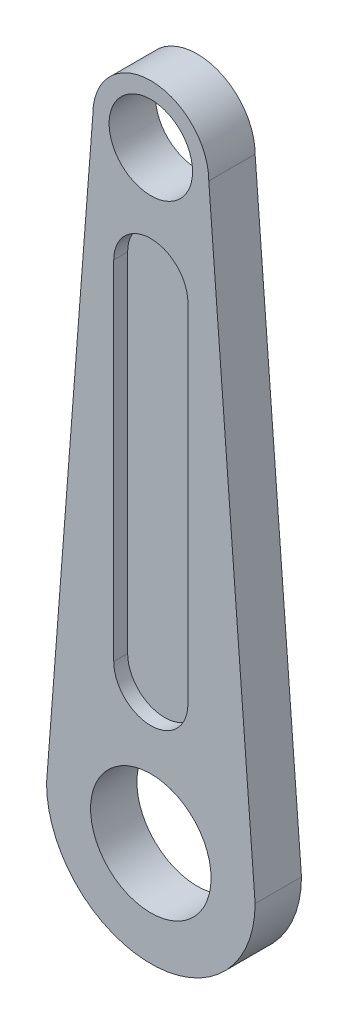
ISO-10303-21;
HEADER;
FILE_DESCRIPTION(('STEP AP214'),'2;1');
FILE_NAME('part.step','',(''),(''),'','','');
FILE_SCHEMA(('AUTOMOTIVE_DESIGN { 1 0 10303 214 1 1 1 1 }'));
ENDSEC;
DATA;
#1=APPLICATION_CONTEXT('core data for automotive mechanical design processes');
#2=APPLICATION_PROTOCOL_DEFINITION('international standard','automotive_design',2000,#1);
#3=PRODUCT_CONTEXT('',#1,'mechanical');
#4=PRODUCT('Part','Part','',(#3));
#5=PRODUCT_RELATED_PRODUCT_CATEGORY('part','',(#4));
#6=PRODUCT_DEFINITION_FORMATION('','',#4);
#7=PRODUCT_DEFINITION_CONTEXT('part definition',#1,'design');
#8=PRODUCT_DEFINITION('design','',#6,#7);
#9=PRODUCT_DEFINITION_SHAPE('','',#8);
#10=(LENGTH_UNIT() NAMED_UNIT(*) SI_UNIT(.MILLI.,.METRE.));
#11=(NAMED_UNIT(*) PLANE_ANGLE_UNIT() SI_UNIT($,.RADIAN.));
#12=(NAMED_UNIT(*) SI_UNIT($,.STERADIAN.) SOLID_ANGLE_UNIT());
#13=UNCERTAINTY_MEASURE_WITH_UNIT(LENGTH_MEASURE(1.E-05),#10,'distance_accuracy_value','');
#14=(GEOMETRIC_REPRESENTATION_CONTEXT(3) GLOBAL_UNCERTAINTY_ASSIGNED_CONTEXT((#13)) GLOBAL_UNIT_ASSIGNED_CONTEXT((#10,
#11,#12)) REPRESENTATION_CONTEXT('',''));
#15=CARTESIAN_POINT('',(0.,0.,0.));
#16=DIRECTION('',(0.,0.,1.));
#17=DIRECTION('',(1.,0.,0.));
#18=AXIS2_PLACEMENT_3D('',#15,#16,#17);
#19=CARTESIAN_POINT('',(0.,0.,-5.));
#20=DIRECTION('',(0.,0.,1.));
#21=DIRECTION('',(1.,0.,0.));
#22=AXIS2_PLACEMENT_3D('',#19,#20,#21);
#23=PLANE('',#22);
#24=DIRECTION('',(-0.076696498884737,-0.997054485501582,0.));
#25=VECTOR('',#24,1.);
#26=CARTESIAN_POINT('',(-22.3676470588235,1.72058823529412,-5.));
#27=LINE('',#26,#25);
#28=CARTESIAN_POINT('',(-12.5,130.,-5.));
#29=VERTEX_POINT('',#28);
#30=CARTESIAN_POINT('',(-22.5,0.,-5.));
#31=VERTEX_POINT('',#30);
#32=EDGE_CURVE('E218',#29,#31,#27,.T.);
#33=ORIENTED_EDGE('',*,*,#32,.F.);
#34=CARTESIAN_POINT('',(0.,130.,-5.));
#35=DIRECTION('',(0.,0.,1.));
#36=DIRECTION('',(1.,0.,0.));
#37=AXIS2_PLACEMENT_3D('',#34,#35,#36);
#38=CIRCLE('',#37,12.5);
#39=CARTESIAN_POINT('',(12.5,130.,-5.));
#40=VERTEX_POINT('',#39);
#41=EDGE_CURVE('E199',#40,#29,#38,.T.);
#42=ORIENTED_EDGE('',*,*,#41,.F.);
#43=DIRECTION('',(0.076696498884737,-0.997054485501582,0.));
#44=VECTOR('',#43,1.);
#45=CARTESIAN_POINT('',(22.3676470588235,1.72058823529412,-5.));
#46=LINE('',#45,#44);
#47=CARTESIAN_POINT('',(22.5,0.,-5.));
#48=VERTEX_POINT('',#47);
#49=EDGE_CURVE('E224',#40,#48,#46,.T.);
#50=ORIENTED_EDGE('',*,*,#49,.T.);
#51=CARTESIAN_POINT('',(0.,0.,-5.));
#52=DIRECTION('',(0.,0.,1.));
#53=DIRECTION('',(1.,0.,0.));
#54=AXIS2_PLACEMENT_3D('',#51,#52,#53);
#55=CIRCLE('',#54,22.5);
#56=EDGE_CURVE('E221',#31,#48,#55,.T.);
#57=ORIENTED_EDGE('',*,*,#56,.F.);
#58=EDGE_LOOP('',(#33,#42,#50,#57));
#59=FACE_BOUND('',#58,.T.);
#60=CARTESIAN_POINT('',(0.,0.,-5.));
#61=DIRECTION('',(0.,0.,1.));
#62=DIRECTION('',(1.,0.,0.));
#63=AXIS2_PLACEMENT_3D('',#60,#61,#62);
#64=CIRCLE('',#63,13.);
#65=CARTESIAN_POINT('',(13.,0.,-5.));
#66=VERTEX_POINT('',#65);
#67=EDGE_CURVE('E215',#66,#66,#64,.T.);
#68=ORIENTED_EDGE('',*,*,#67,.T.);
#69=EDGE_LOOP('',(#68));
#70=FACE_BOUND('',#69,.T.);
#71=CARTESIAN_POINT('',(0.,130.,-5.));
#72=DIRECTION('',(0.,0.,1.));
#73=DIRECTION('',(1.,0.,0.));
#74=AXIS2_PLACEMENT_3D('',#71,#72,#73);
#75=CIRCLE('',#74,9.);
#76=CARTESIAN_POINT('',(9.,130.,-5.));
#77=VERTEX_POINT('',#76);
#78=EDGE_CURVE('E189',#77,#77,#75,.T.);
#79=ORIENTED_EDGE('',*,*,#78,.T.);
#80=EDGE_LOOP('',(#79));
#81=FACE_BOUND('',#80,.T.);
#82=CARTESIAN_POINT('',(0.,105.,-5.));
#83=DIRECTION('',(0.,0.,1.));
#84=DIRECTION('',(1.,0.,0.));
#85=AXIS2_PLACEMENT_3D('',#82,#83,#84);
#86=CIRCLE('',#85,8.);
#87=CARTESIAN_POINT('',(8.,105.,-5.));
#88=VERTEX_POINT('',#87);
#89=CARTESIAN_POINT('',(-8.,105.,-5.));
#90=VERTEX_POINT('',#89);
#91=EDGE_CURVE('E52',#88,#90,#86,.T.);
#92=ORIENTED_EDGE('',*,*,#91,.T.);
#93=DIRECTION('',(0.,-1.,0.));
#94=VECTOR('',#93,1.);
#95=CARTESIAN_POINT('',(-8.,105.,-5.));
#96=LINE('',#95,#94);
#97=CARTESIAN_POINT('',(-7.99999999999999,30.,-5.));
#98=VERTEX_POINT('',#97);
#99=EDGE_CURVE('E146',#90,#98,#96,.T.);
#100=ORIENTED_EDGE('',*,*,#99,.T.);
#101=CARTESIAN_POINT('',(0.,30.,-5.));
#102=DIRECTION('',(0.,0.,1.));
#103=DIRECTION('',(1.,0.,0.));
#104=AXIS2_PLACEMENT_3D('',#101,#102,#103);
#105=CIRCLE('',#104,8.);
#106=CARTESIAN_POINT('',(8.00000000000001,30.,-5.));
#107=VERTEX_POINT('',#106);
#108=EDGE_CURVE('E149',#98,#107,#105,.T.);
#109=ORIENTED_EDGE('',*,*,#108,.T.);
#110=DIRECTION('',(0.,1.,0.));
#111=VECTOR('',#110,1.);
#112=CARTESIAN_POINT('',(8.,105.,-5.));
#113=LINE('',#112,#111);
#114=EDGE_CURVE('E155',#107,#88,#113,.T.);
#115=ORIENTED_EDGE('',*,*,#114,.T.);
#116=EDGE_LOOP('',(#92,#100,#109,#115));
#117=FACE_BOUND('',#116,.T.);
#118=ADVANCED_FACE('F37',(#59,#70,#81,#117),#23,.F.);
#119=CARTESIAN_POINT('',(-22.3676470588235,1.72058823529412,5.));
#120=DIRECTION('',(0.997054485501582,-0.076696498884737,0.));
#121=DIRECTION('',(0.076696498884737,0.997054485501582,0.));
#122=AXIS2_PLACEMENT_3D('',#119,#120,#121);
#123=PLANE('',#122);
#124=ORIENTED_EDGE('',*,*,#32,.T.);
#125=DIRECTION('',(0.,0.,-1.));
#126=VECTOR('',#125,1.);
#127=CARTESIAN_POINT('',(-22.5,0.,5.));
#128=LINE('',#127,#126);
#129=CARTESIAN_POINT('',(-22.5,0.,5.));
#130=VERTEX_POINT('',#129);
#131=EDGE_CURVE('E11',#130,#31,#128,.T.);
#132=ORIENTED_EDGE('',*,*,#131,.F.);
#133=DIRECTION('',(-0.076696498884737,-0.997054485501582,0.));
#134=VECTOR('',#133,1.);
#135=CARTESIAN_POINT('',(-22.3676470588235,1.72058823529412,5.));
#136=LINE('',#135,#134);
#137=CARTESIAN_POINT('',(-12.5,130.,5.));
#138=VERTEX_POINT('',#137);
#139=EDGE_CURVE('E202',#138,#130,#136,.T.);
#140=ORIENTED_EDGE('',*,*,#139,.F.);
#141=DIRECTION('',(0.,0.,-1.));
#142=VECTOR('',#141,1.);
#143=CARTESIAN_POINT('',(-12.5,130.,5.));
#144=LINE('',#143,#142);
#145=EDGE_CURVE('E212',#138,#29,#144,.T.);
#146=ORIENTED_EDGE('',*,*,#145,.T.);
#147=EDGE_LOOP('',(#124,#132,#140,#146));
#148=FACE_BOUND('',#147,.T.);
#149=ADVANCED_FACE('F249',(#148),#123,.F.);
#150=CARTESIAN_POINT('',(0.,0.,5.));
#151=DIRECTION('',(0.,0.,-1.));
#152=DIRECTION('',(-1.,0.,0.));
#153=AXIS2_PLACEMENT_3D('',#150,#151,#152);
#154=CYLINDRICAL_SURFACE('',#153,22.5);
#155=ORIENTED_EDGE('',*,*,#56,.T.);
#156=DIRECTION('',(0.,0.,-1.));
#157=VECTOR('',#156,1.);
#158=CARTESIAN_POINT('',(22.5,0.,5.));
#159=LINE('',#158,#157);
#160=CARTESIAN_POINT('',(22.5,0.,5.));
#161=VERTEX_POINT('',#160);
#162=EDGE_CURVE('E45',#161,#48,#159,.T.);
#163=ORIENTED_EDGE('',*,*,#162,.F.);
#164=CARTESIAN_POINT('',(0.,0.,5.));
#165=DIRECTION('',(0.,0.,1.));
#166=DIRECTION('',(1.,0.,0.));
#167=AXIS2_PLACEMENT_3D('',#164,#165,#166);
#168=CIRCLE('',#167,22.5);
#169=EDGE_CURVE('E205',#130,#161,#168,.T.);
#170=ORIENTED_EDGE('',*,*,#169,.F.);
#171=ORIENTED_EDGE('',*,*,#131,.T.);
#172=EDGE_LOOP('',(#155,#163,#170,#171));
#173=FACE_BOUND('',#172,.T.);
#174=ADVANCED_FACE('F237',(#173),#154,.T.);
#175=CARTESIAN_POINT('',(22.3676470588235,1.72058823529412,5.));
#176=DIRECTION('',(0.997054485501582,0.076696498884737,0.));
#177=DIRECTION('',(-0.076696498884737,0.997054485501582,0.));
#178=AXIS2_PLACEMENT_3D('',#175,#176,#177);
#179=PLANE('',#178);
#180=ORIENTED_EDGE('',*,*,#49,.F.);
#181=DIRECTION('',(0.,0.,-1.));
#182=VECTOR('',#181,1.);
#183=CARTESIAN_POINT('',(12.5,130.,5.));
#184=LINE('',#183,#182);
#185=CARTESIAN_POINT('',(12.5,130.,5.));
#186=VERTEX_POINT('',#185);
#187=EDGE_CURVE('E230',#186,#40,#184,.T.);
#188=ORIENTED_EDGE('',*,*,#187,.F.);
#189=DIRECTION('',(0.076696498884737,-0.997054485501582,0.));
#190=VECTOR('',#189,1.);
#191=CARTESIAN_POINT('',(22.3676470588235,1.72058823529412,5.));
#192=LINE('',#191,#190);
#193=EDGE_CURVE('E207',#186,#161,#192,.T.);
#194=ORIENTED_EDGE('',*,*,#193,.T.);
#195=ORIENTED_EDGE('',*,*,#162,.T.);
#196=EDGE_LOOP('',(#180,#188,#194,#195));
#197=FACE_BOUND('',#196,.T.);
#198=ADVANCED_FACE('F234',(#197),#179,.T.);
#199=CARTESIAN_POINT('',(0.,0.,5.));
#200=DIRECTION('',(0.,0.,-1.));
#201=DIRECTION('',(-1.,0.,0.));
#202=AXIS2_PLACEMENT_3D('',#199,#200,#201);
#203=CYLINDRICAL_SURFACE('',#202,13.);
#204=CARTESIAN_POINT('',(0.,0.,5.));
#205=DIRECTION('',(0.,0.,1.));
#206=DIRECTION('',(1.,0.,0.));
#207=AXIS2_PLACEMENT_3D('',#204,#205,#206);
#208=CIRCLE('',#207,13.);
#209=CARTESIAN_POINT('',(13.,0.,5.));
#210=VERTEX_POINT('',#209);
#211=EDGE_CURVE('E198',#210,#210,#208,.T.);
#212=ORIENTED_EDGE('',*,*,#211,.T.);
#213=EDGE_LOOP('',(#212));
#214=FACE_BOUND('',#213,.T.);
#215=ORIENTED_EDGE('',*,*,#67,.F.);
#216=EDGE_LOOP('',(#215));
#217=FACE_BOUND('',#216,.T.);
#218=ADVANCED_FACE('F273',(#214,#217),#203,.F.);
#219=CARTESIAN_POINT('',(0.,130.,5.));
#220=DIRECTION('',(0.,0.,-1.));
#221=DIRECTION('',(-1.,0.,0.));
#222=AXIS2_PLACEMENT_3D('',#219,#220,#221);
#223=CYLINDRICAL_SURFACE('',#222,9.);
#224=CARTESIAN_POINT('',(0.,130.,5.));
#225=DIRECTION('',(0.,0.,1.));
#226=DIRECTION('',(1.,0.,0.));
#227=AXIS2_PLACEMENT_3D('',#224,#225,#226);
#228=CIRCLE('',#227,9.);
#229=CARTESIAN_POINT('',(9.,130.,5.));
#230=VERTEX_POINT('',#229);
#231=EDGE_CURVE('E195',#230,#230,#228,.T.);
#232=ORIENTED_EDGE('',*,*,#231,.T.);
#233=EDGE_LOOP('',(#232));
#234=FACE_BOUND('',#233,.T.);
#235=ORIENTED_EDGE('',*,*,#78,.F.);
#236=EDGE_LOOP('',(#235));
#237=FACE_BOUND('',#236,.T.);
#238=ADVANCED_FACE('F39',(#234,#237),#223,.F.);
#239=CARTESIAN_POINT('',(0.,130.,5.));
#240=DIRECTION('',(0.,0.,-1.));
#241=DIRECTION('',(-1.,0.,0.));
#242=AXIS2_PLACEMENT_3D('',#239,#240,#241);
#243=CYLINDRICAL_SURFACE('',#242,12.5);
#244=ORIENTED_EDGE('',*,*,#41,.T.);
#245=ORIENTED_EDGE('',*,*,#145,.F.);
#246=CARTESIAN_POINT('',(0.,130.,5.));
#247=DIRECTION('',(0.,0.,1.));
#248=DIRECTION('',(1.,0.,0.));
#249=AXIS2_PLACEMENT_3D('',#246,#247,#248);
#250=CIRCLE('',#249,12.5);
#251=EDGE_CURVE('E210',#186,#138,#250,.T.);
#252=ORIENTED_EDGE('',*,*,#251,.F.);
#253=ORIENTED_EDGE('',*,*,#187,.T.);
#254=EDGE_LOOP('',(#244,#245,#252,#253));
#255=FACE_BOUND('',#254,.T.);
#256=ADVANCED_FACE('F245',(#255),#243,.T.);
#257=CARTESIAN_POINT('',(0.,0.,5.));
#258=DIRECTION('',(0.,0.,1.));
#259=DIRECTION('',(1.,0.,0.));
#260=AXIS2_PLACEMENT_3D('',#257,#258,#259);
#261=PLANE('',#260);
#262=CARTESIAN_POINT('',(0.,105.,5.));
#263=DIRECTION('',(0.,0.,1.));
#264=DIRECTION('',(1.,0.,0.));
#265=AXIS2_PLACEMENT_3D('',#262,#263,#264);
#266=CIRCLE('',#265,8.);
#267=CARTESIAN_POINT('',(8.,105.,5.));
#268=VERTEX_POINT('',#267);
#269=CARTESIAN_POINT('',(-8.,105.,5.));
#270=VERTEX_POINT('',#269);
#271=EDGE_CURVE('E60',#268,#270,#266,.T.);
#272=ORIENTED_EDGE('',*,*,#271,.F.);
#273=DIRECTION('',(0.,1.,0.));
#274=VECTOR('',#273,1.);
#275=CARTESIAN_POINT('',(8.,105.,5.));
#276=LINE('',#275,#274);
#277=CARTESIAN_POINT('',(8.00000000000001,30.,5.));
#278=VERTEX_POINT('',#277);
#279=EDGE_CURVE('E168',#278,#268,#276,.T.);
#280=ORIENTED_EDGE('',*,*,#279,.F.);
#281=CARTESIAN_POINT('',(0.,30.,5.));
#282=DIRECTION('',(0.,0.,1.));
#283=DIRECTION('',(1.,0.,0.));
#284=AXIS2_PLACEMENT_3D('',#281,#282,#283);
#285=CIRCLE('',#284,8.);
#286=CARTESIAN_POINT('',(-7.99999999999999,30.,5.));
#287=VERTEX_POINT('',#286);
#288=EDGE_CURVE('E182',#287,#278,#285,.T.);
#289=ORIENTED_EDGE('',*,*,#288,.F.);
#290=DIRECTION('',(0.,-1.,0.));
#291=VECTOR('',#290,1.);
#292=CARTESIAN_POINT('',(-8.,105.,5.));
#293=LINE('',#292,#291);
#294=EDGE_CURVE('E179',#270,#287,#293,.T.);
#295=ORIENTED_EDGE('',*,*,#294,.F.);
#296=EDGE_LOOP('',(#272,#280,#289,#295));
#297=FACE_BOUND('',#296,.T.);
#298=ORIENTED_EDGE('',*,*,#231,.F.);
#299=EDGE_LOOP('',(#298));
#300=FACE_BOUND('',#299,.T.);
#301=ORIENTED_EDGE('',*,*,#211,.F.);
#302=EDGE_LOOP('',(#301));
#303=FACE_BOUND('',#302,.T.);
#304=ORIENTED_EDGE('',*,*,#139,.T.);
#305=ORIENTED_EDGE('',*,*,#169,.T.);
#306=ORIENTED_EDGE('',*,*,#193,.F.);
#307=ORIENTED_EDGE('',*,*,#251,.T.);
#308=EDGE_LOOP('',(#304,#305,#306,#307));
#309=FACE_BOUND('',#308,.T.);
#310=ADVANCED_FACE('F251',(#297,#300,#303,#309),#261,.T.);
#311=CARTESIAN_POINT('',(0.,105.,2.));
#312=DIRECTION('',(0.,0.,1.));
#313=DIRECTION('',(1.,0.,0.));
#314=AXIS2_PLACEMENT_3D('',#311,#312,#313);
#315=CYLINDRICAL_SURFACE('',#314,8.);
#316=ORIENTED_EDGE('',*,*,#271,.T.);
#317=DIRECTION('',(0.,0.,1.));
#318=VECTOR('',#317,1.);
#319=CARTESIAN_POINT('',(-8.,105.,2.));
#320=LINE('',#319,#318);
#321=CARTESIAN_POINT('',(-8.,105.,2.));
#322=VERTEX_POINT('',#321);
#323=EDGE_CURVE('E177',#322,#270,#320,.T.);
#324=ORIENTED_EDGE('',*,*,#323,.F.);
#325=CARTESIAN_POINT('',(0.,105.,2.));
#326=DIRECTION('',(0.,0.,1.));
#327=DIRECTION('',(1.,0.,0.));
#328=AXIS2_PLACEMENT_3D('',#325,#326,#327);
#329=CIRCLE('',#328,8.);
#330=CARTESIAN_POINT('',(8.,105.,2.));
#331=VERTEX_POINT('',#330);
#332=EDGE_CURVE('E164',#331,#322,#329,.T.);
#333=ORIENTED_EDGE('',*,*,#332,.F.);
#334=DIRECTION('',(0.,0.,1.));
#335=VECTOR('',#334,1.);
#336=CARTESIAN_POINT('',(8.,105.,2.));
#337=LINE('',#336,#335);
#338=EDGE_CURVE('E187',#331,#268,#337,.T.);
#339=ORIENTED_EDGE('',*,*,#338,.T.);
#340=EDGE_LOOP('',(#316,#324,#333,#339));
#341=FACE_BOUND('',#340,.T.);
#342=ADVANCED_FACE('F253',(#341),#315,.F.);
#343=CARTESIAN_POINT('',(8.,105.,2.));
#344=DIRECTION('',(1.,0.,0.));
#345=DIRECTION('',(0.,1.,0.));
#346=AXIS2_PLACEMENT_3D('',#343,#344,#345);
#347=PLANE('',#346);
#348=ORIENTED_EDGE('',*,*,#279,.T.);
#349=ORIENTED_EDGE('',*,*,#338,.F.);
#350=DIRECTION('',(0.,1.,0.));
#351=VECTOR('',#350,1.);
#352=CARTESIAN_POINT('',(8.,105.,2.));
#353=LINE('',#352,#351);
#354=CARTESIAN_POINT('',(8.00000000000001,30.,2.));
#355=VERTEX_POINT('',#354);
#356=EDGE_CURVE('E174',#355,#331,#353,.T.);
#357=ORIENTED_EDGE('',*,*,#356,.F.);
#358=DIRECTION('',(0.,0.,1.));
#359=VECTOR('',#358,1.);
#360=CARTESIAN_POINT('',(8.00000000000001,30.,2.));
#361=LINE('',#360,#359);
#362=EDGE_CURVE('E190',#355,#278,#361,.T.);
#363=ORIENTED_EDGE('',*,*,#362,.T.);
#364=EDGE_LOOP('',(#348,#349,#357,#363));
#365=FACE_BOUND('',#364,.T.);
#366=ADVANCED_FACE('F260',(#365),#347,.F.);
#367=CARTESIAN_POINT('',(0.,30.,2.));
#368=DIRECTION('',(0.,0.,1.));
#369=DIRECTION('',(1.,0.,0.));
#370=AXIS2_PLACEMENT_3D('',#367,#368,#369);
#371=CYLINDRICAL_SURFACE('',#370,8.);
#372=ORIENTED_EDGE('',*,*,#288,.T.);
#373=ORIENTED_EDGE('',*,*,#362,.F.);
#374=CARTESIAN_POINT('',(0.,30.,2.));
#375=DIRECTION('',(0.,0.,1.));
#376=DIRECTION('',(1.,0.,0.));
#377=AXIS2_PLACEMENT_3D('',#374,#375,#376);
#378=CIRCLE('',#377,8.);
#379=CARTESIAN_POINT('',(-7.99999999999999,30.,2.));
#380=VERTEX_POINT('',#379);
#381=EDGE_CURVE('E171',#380,#355,#378,.T.);
#382=ORIENTED_EDGE('',*,*,#381,.F.);
#383=DIRECTION('',(0.,0.,1.));
#384=VECTOR('',#383,1.);
#385=CARTESIAN_POINT('',(-7.99999999999999,30.,2.));
#386=LINE('',#385,#384);
#387=EDGE_CURVE('E192',#380,#287,#386,.T.);
#388=ORIENTED_EDGE('',*,*,#387,.T.);
#389=EDGE_LOOP('',(#372,#373,#382,#388));
#390=FACE_BOUND('',#389,.T.);
#391=ADVANCED_FACE('F312',(#390),#371,.F.);
#392=CARTESIAN_POINT('',(-8.,105.,2.));
#393=DIRECTION('',(-1.,0.,0.));
#394=DIRECTION('',(0.,-1.,0.));
#395=AXIS2_PLACEMENT_3D('',#392,#393,#394);
#396=PLANE('',#395);
#397=ORIENTED_EDGE('',*,*,#294,.T.);
#398=ORIENTED_EDGE('',*,*,#387,.F.);
#399=DIRECTION('',(0.,-1.,0.));
#400=VECTOR('',#399,1.);
#401=CARTESIAN_POINT('',(-8.,105.,2.));
#402=LINE('',#401,#400);
#403=EDGE_CURVE('E167',#322,#380,#402,.T.);
#404=ORIENTED_EDGE('',*,*,#403,.F.);
#405=ORIENTED_EDGE('',*,*,#323,.T.);
#406=EDGE_LOOP('',(#397,#398,#404,#405));
#407=FACE_BOUND('',#406,.T.);
#408=ADVANCED_FACE('F308',(#407),#396,.F.);
#409=CARTESIAN_POINT('',(0.,105.,2.));
#410=DIRECTION('',(0.,0.,1.));
#411=DIRECTION('',(1.,0.,0.));
#412=AXIS2_PLACEMENT_3D('',#409,#410,#411);
#413=PLANE('',#412);
#414=ORIENTED_EDGE('',*,*,#332,.T.);
#415=ORIENTED_EDGE('',*,*,#403,.T.);
#416=ORIENTED_EDGE('',*,*,#381,.T.);
#417=ORIENTED_EDGE('',*,*,#356,.T.);
#418=EDGE_LOOP('',(#414,#415,#416,#417));
#419=FACE_BOUND('',#418,.T.);
#420=ADVANCED_FACE('F300',(#419),#413,.T.);
#421=CARTESIAN_POINT('',(0.,105.,-2.));
#422=DIRECTION('',(0.,0.,-1.));
#423=DIRECTION('',(-1.,0.,0.));
#424=AXIS2_PLACEMENT_3D('',#421,#422,#423);
#425=CYLINDRICAL_SURFACE('',#424,8.);
#426=ORIENTED_EDGE('',*,*,#91,.F.);
#427=DIRECTION('',(0.,0.,-1.));
#428=VECTOR('',#427,1.);
#429=CARTESIAN_POINT('',(8.,105.,-2.));
#430=LINE('',#429,#428);
#431=CARTESIAN_POINT('',(8.,105.,-2.));
#432=VERTEX_POINT('',#431);
#433=EDGE_CURVE('E131',#432,#88,#430,.T.);
#434=ORIENTED_EDGE('',*,*,#433,.F.);
#435=CARTESIAN_POINT('',(0.,105.,-2.));
#436=DIRECTION('',(0.,0.,1.));
#437=DIRECTION('',(1.,0.,0.));
#438=AXIS2_PLACEMENT_3D('',#435,#436,#437);
#439=CIRCLE('',#438,8.);
#440=CARTESIAN_POINT('',(-8.,105.,-2.));
#441=VERTEX_POINT('',#440);
#442=EDGE_CURVE('E138',#432,#441,#439,.T.);
#443=ORIENTED_EDGE('',*,*,#442,.T.);
#444=DIRECTION('',(0.,0.,-1.));
#445=VECTOR('',#444,1.);
#446=CARTESIAN_POINT('',(-8.,105.,-2.));
#447=LINE('',#446,#445);
#448=EDGE_CURVE('E159',#441,#90,#447,.T.);
#449=ORIENTED_EDGE('',*,*,#448,.T.);
#450=EDGE_LOOP('',(#426,#434,#443,#449));
#451=FACE_BOUND('',#450,.T.);
#452=ADVANCED_FACE('F141',(#451),#425,.F.);
#453=CARTESIAN_POINT('',(-8.,105.,-2.));
#454=DIRECTION('',(1.,0.,0.));
#455=DIRECTION('',(0.,1.,0.));
#456=AXIS2_PLACEMENT_3D('',#453,#454,#455);
#457=PLANE('',#456);
#458=ORIENTED_EDGE('',*,*,#99,.F.);
#459=ORIENTED_EDGE('',*,*,#448,.F.);
#460=DIRECTION('',(0.,-1.,0.));
#461=VECTOR('',#460,1.);
#462=CARTESIAN_POINT('',(-8.,105.,-2.));
#463=LINE('',#462,#461);
#464=CARTESIAN_POINT('',(-7.99999999999999,30.,-2.));
#465=VERTEX_POINT('',#464);
#466=EDGE_CURVE('E143',#441,#465,#463,.T.);
#467=ORIENTED_EDGE('',*,*,#466,.T.);
#468=DIRECTION('',(0.,0.,-1.));
#469=VECTOR('',#468,1.);
#470=CARTESIAN_POINT('',(-7.99999999999999,30.,-2.));
#471=LINE('',#470,#469);
#472=EDGE_CURVE('E161',#465,#98,#471,.T.);
#473=ORIENTED_EDGE('',*,*,#472,.T.);
#474=EDGE_LOOP('',(#458,#459,#467,#473));
#475=FACE_BOUND('',#474,.T.);
#476=ADVANCED_FACE('F292',(#475),#457,.T.);
#477=CARTESIAN_POINT('',(0.,30.,-2.));
#478=DIRECTION('',(0.,0.,-1.));
#479=DIRECTION('',(-1.,0.,0.));
#480=AXIS2_PLACEMENT_3D('',#477,#478,#479);
#481=CYLINDRICAL_SURFACE('',#480,8.);
#482=ORIENTED_EDGE('',*,*,#108,.F.);
#483=ORIENTED_EDGE('',*,*,#472,.F.);
#484=CARTESIAN_POINT('',(0.,30.,-2.));
#485=DIRECTION('',(0.,0.,1.));
#486=DIRECTION('',(1.,0.,0.));
#487=AXIS2_PLACEMENT_3D('',#484,#485,#486);
#488=CIRCLE('',#487,8.);
#489=CARTESIAN_POINT('',(8.00000000000001,30.,-2.));
#490=VERTEX_POINT('',#489);
#491=EDGE_CURVE('E137',#465,#490,#488,.T.);
#492=ORIENTED_EDGE('',*,*,#491,.T.);
#493=DIRECTION('',(0.,0.,-1.));
#494=VECTOR('',#493,1.);
#495=CARTESIAN_POINT('',(8.00000000000001,30.,-2.));
#496=LINE('',#495,#494);
#497=EDGE_CURVE('E133',#490,#107,#496,.T.);
#498=ORIENTED_EDGE('',*,*,#497,.T.);
#499=EDGE_LOOP('',(#482,#483,#492,#498));
#500=FACE_BOUND('',#499,.T.);
#501=ADVANCED_FACE('F290',(#500),#481,.F.);
#502=CARTESIAN_POINT('',(8.,105.,-2.));
#503=DIRECTION('',(-1.,0.,0.));
#504=DIRECTION('',(0.,-1.,0.));
#505=AXIS2_PLACEMENT_3D('',#502,#503,#504);
#506=PLANE('',#505);
#507=ORIENTED_EDGE('',*,*,#114,.F.);
#508=ORIENTED_EDGE('',*,*,#497,.F.);
#509=DIRECTION('',(0.,1.,0.));
#510=VECTOR('',#509,1.);
#511=CARTESIAN_POINT('',(8.,105.,-2.));
#512=LINE('',#511,#510);
#513=EDGE_CURVE('E128',#490,#432,#512,.T.);
#514=ORIENTED_EDGE('',*,*,#513,.T.);
#515=ORIENTED_EDGE('',*,*,#433,.T.);
#516=EDGE_LOOP('',(#507,#508,#514,#515));
#517=FACE_BOUND('',#516,.T.);
#518=ADVANCED_FACE('F130',(#517),#506,.T.);
#519=CARTESIAN_POINT('',(0.,105.,-2.));
#520=DIRECTION('',(0.,0.,-1.));
#521=DIRECTION('',(1.,0.,0.));
#522=AXIS2_PLACEMENT_3D('',#519,#520,#521);
#523=PLANE('',#522);
#524=ORIENTED_EDGE('',*,*,#442,.F.);
#525=ORIENTED_EDGE('',*,*,#513,.F.);
#526=ORIENTED_EDGE('',*,*,#491,.F.);
#527=ORIENTED_EDGE('',*,*,#466,.F.);
#528=EDGE_LOOP('',(#524,#525,#526,#527));
#529=FACE_BOUND('',#528,.T.);
#530=ADVANCED_FACE('F145',(#529),#523,.T.);
#531=CLOSED_SHELL('',(#118,#149,#174,#198,#218,#238,#256,#310,#342,#366,#391,#408,#420,#452,
#476,#501,#518,#530));
#532=MANIFOLD_SOLID_BREP('B2',#531);
#533=ADVANCED_BREP_SHAPE_REPRESENTATION('',(#18,#532),#14);
#534=SHAPE_DEFINITION_REPRESENTATION(#9,#533);
ENDSEC;
END-ISO-10303-21;
